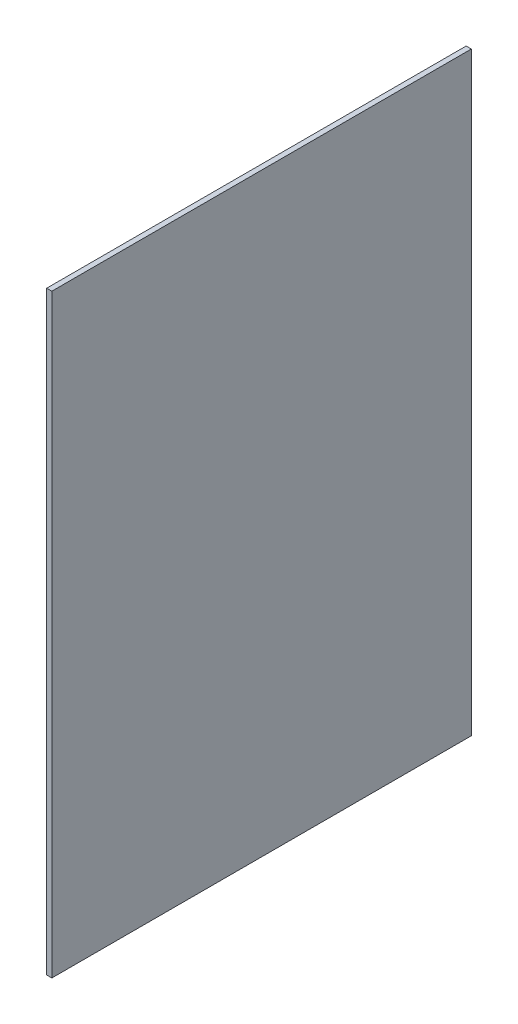
ISO-10303-21;
HEADER;
FILE_DESCRIPTION(('STEP AP214'),'2;1');
FILE_NAME('part.step','',(''),(''),'','','');
FILE_SCHEMA(('AUTOMOTIVE_DESIGN { 1 0 10303 214 1 1 1 1 }'));
ENDSEC;
DATA;
#1=APPLICATION_CONTEXT('core data for automotive mechanical design processes');
#2=APPLICATION_PROTOCOL_DEFINITION('international standard','automotive_design',2000,#1);
#3=PRODUCT_CONTEXT('',#1,'mechanical');
#4=PRODUCT('Part','Part','',(#3));
#5=PRODUCT_RELATED_PRODUCT_CATEGORY('part','',(#4));
#6=PRODUCT_DEFINITION_FORMATION('','',#4);
#7=PRODUCT_DEFINITION_CONTEXT('part definition',#1,'design');
#8=PRODUCT_DEFINITION('design','',#6,#7);
#9=PRODUCT_DEFINITION_SHAPE('','',#8);
#10=(LENGTH_UNIT() NAMED_UNIT(*) SI_UNIT(.MILLI.,.METRE.));
#11=(NAMED_UNIT(*) PLANE_ANGLE_UNIT() SI_UNIT($,.RADIAN.));
#12=(NAMED_UNIT(*) SI_UNIT($,.STERADIAN.) SOLID_ANGLE_UNIT());
#13=UNCERTAINTY_MEASURE_WITH_UNIT(LENGTH_MEASURE(1.E-05),#10,'distance_accuracy_value','');
#14=(GEOMETRIC_REPRESENTATION_CONTEXT(3) GLOBAL_UNCERTAINTY_ASSIGNED_CONTEXT((#13)) GLOBAL_UNIT_ASSIGNED_CONTEXT((#10,
#11,#12)) REPRESENTATION_CONTEXT('',''));
#15=CARTESIAN_POINT('',(0.,0.,0.));
#16=DIRECTION('',(0.,0.,1.));
#17=DIRECTION('',(1.,0.,0.));
#18=AXIS2_PLACEMENT_3D('',#15,#16,#17);
#19=CARTESIAN_POINT('',(281.,-45.,81.035636223129));
#20=DIRECTION('',(0.,0.,-1.));
#21=DIRECTION('',(-1.,0.,0.));
#22=AXIS2_PLACEMENT_3D('',#19,#20,#21);
#23=PLANE('',#22);
#24=DIRECTION('',(0.,-1.,0.));
#25=VECTOR('',#24,1.);
#26=CARTESIAN_POINT('',(280.,-45.,81.035636223129));
#27=LINE('',#26,#25);
#28=CARTESIAN_POINT('',(280.,69.8959813156576,81.035636223129));
#29=VERTEX_POINT('',#28);
#30=CARTESIAN_POINT('',(280.,-45.,81.035636223129));
#31=VERTEX_POINT('',#30);
#32=EDGE_CURVE('E101',#29,#31,#27,.T.);
#33=ORIENTED_EDGE('',*,*,#32,.T.);
#34=DIRECTION('',(-1.,0.,0.));
#35=VECTOR('',#34,1.);
#36=CARTESIAN_POINT('',(281.,-45.,81.035636223129));
#37=LINE('',#36,#35);
#38=CARTESIAN_POINT('',(281.,-45.,81.035636223129));
#39=VERTEX_POINT('',#38);
#40=EDGE_CURVE('E11',#39,#31,#37,.T.);
#41=ORIENTED_EDGE('',*,*,#40,.F.);
#42=DIRECTION('',(0.,-1.,0.));
#43=VECTOR('',#42,1.);
#44=CARTESIAN_POINT('',(281.,-45.,81.035636223129));
#45=LINE('',#44,#43);
#46=CARTESIAN_POINT('',(281.,69.8959813156576,81.035636223129));
#47=VERTEX_POINT('',#46);
#48=EDGE_CURVE('E89',#47,#39,#45,.T.);
#49=ORIENTED_EDGE('',*,*,#48,.F.);
#50=DIRECTION('',(-1.,0.,0.));
#51=VECTOR('',#50,1.);
#52=CARTESIAN_POINT('',(281.,69.8959813156576,81.035636223129));
#53=LINE('',#52,#51);
#54=EDGE_CURVE('E97',#47,#29,#53,.T.);
#55=ORIENTED_EDGE('',*,*,#54,.T.);
#56=EDGE_LOOP('',(#33,#41,#49,#55));
#57=FACE_BOUND('',#56,.T.);
#58=ADVANCED_FACE('F38',(#57),#23,.F.);
#59=CARTESIAN_POINT('',(281.,-45.,81.035636223129));
#60=DIRECTION('',(0.,1.,0.));
#61=DIRECTION('',(0.,0.,1.));
#62=AXIS2_PLACEMENT_3D('',#59,#60,#61);
#63=PLANE('',#62);
#64=DIRECTION('',(0.,0.,-1.));
#65=VECTOR('',#64,1.);
#66=CARTESIAN_POINT('',(280.,-45.,81.035636223129));
#67=LINE('',#66,#65);
#68=CARTESIAN_POINT('',(280.,-45.,0.));
#69=VERTEX_POINT('',#68);
#70=EDGE_CURVE('E93',#31,#69,#67,.T.);
#71=ORIENTED_EDGE('',*,*,#70,.T.);
#72=DIRECTION('',(-1.,0.,0.));
#73=VECTOR('',#72,1.);
#74=CARTESIAN_POINT('',(281.,-45.,0.));
#75=LINE('',#74,#73);
#76=CARTESIAN_POINT('',(281.,-45.,0.));
#77=VERTEX_POINT('',#76);
#78=EDGE_CURVE('E46',#77,#69,#75,.T.);
#79=ORIENTED_EDGE('',*,*,#78,.F.);
#80=DIRECTION('',(0.,0.,-1.));
#81=VECTOR('',#80,1.);
#82=CARTESIAN_POINT('',(281.,-45.,81.035636223129));
#83=LINE('',#82,#81);
#84=EDGE_CURVE('E84',#39,#77,#83,.T.);
#85=ORIENTED_EDGE('',*,*,#84,.F.);
#86=ORIENTED_EDGE('',*,*,#40,.T.);
#87=EDGE_LOOP('',(#71,#79,#85,#86));
#88=FACE_BOUND('',#87,.T.);
#89=ADVANCED_FACE('F92',(#88),#63,.F.);
#90=CARTESIAN_POINT('',(281.,-45.,0.));
#91=DIRECTION('',(0.,0.,1.));
#92=DIRECTION('',(1.,0.,0.));
#93=AXIS2_PLACEMENT_3D('',#90,#91,#92);
#94=PLANE('',#93);
#95=DIRECTION('',(0.,1.,0.));
#96=VECTOR('',#95,1.);
#97=CARTESIAN_POINT('',(280.,-45.,0.));
#98=LINE('',#97,#96);
#99=CARTESIAN_POINT('',(280.,69.8959813156576,0.));
#100=VERTEX_POINT('',#99);
#101=EDGE_CURVE('E71',#69,#100,#98,.T.);
#102=ORIENTED_EDGE('',*,*,#101,.T.);
#103=DIRECTION('',(-1.,0.,0.));
#104=VECTOR('',#103,1.);
#105=CARTESIAN_POINT('',(281.,69.8959813156576,0.));
#106=LINE('',#105,#104);
#107=CARTESIAN_POINT('',(281.,69.8959813156576,0.));
#108=VERTEX_POINT('',#107);
#109=EDGE_CURVE('E94',#108,#100,#106,.T.);
#110=ORIENTED_EDGE('',*,*,#109,.F.);
#111=DIRECTION('',(0.,1.,0.));
#112=VECTOR('',#111,1.);
#113=CARTESIAN_POINT('',(281.,-45.,0.));
#114=LINE('',#113,#112);
#115=EDGE_CURVE('E87',#77,#108,#114,.T.);
#116=ORIENTED_EDGE('',*,*,#115,.F.);
#117=ORIENTED_EDGE('',*,*,#78,.T.);
#118=EDGE_LOOP('',(#102,#110,#116,#117));
#119=FACE_BOUND('',#118,.T.);
#120=ADVANCED_FACE('F95',(#119),#94,.F.);
#121=CARTESIAN_POINT('',(281.,69.8959813156576,81.035636223129));
#122=DIRECTION('',(0.,-1.,0.));
#123=DIRECTION('',(0.,0.,-1.));
#124=AXIS2_PLACEMENT_3D('',#121,#122,#123);
#125=PLANE('',#124);
#126=DIRECTION('',(0.,0.,1.));
#127=VECTOR('',#126,1.);
#128=CARTESIAN_POINT('',(280.,69.8959813156576,81.035636223129));
#129=LINE('',#128,#127);
#130=EDGE_CURVE('E77',#100,#29,#129,.T.);
#131=ORIENTED_EDGE('',*,*,#130,.T.);
#132=ORIENTED_EDGE('',*,*,#54,.F.);
#133=DIRECTION('',(0.,0.,1.));
#134=VECTOR('',#133,1.);
#135=CARTESIAN_POINT('',(281.,69.8959813156576,81.035636223129));
#136=LINE('',#135,#134);
#137=EDGE_CURVE('E54',#108,#47,#136,.T.);
#138=ORIENTED_EDGE('',*,*,#137,.F.);
#139=ORIENTED_EDGE('',*,*,#109,.T.);
#140=EDGE_LOOP('',(#131,#132,#138,#139));
#141=FACE_BOUND('',#140,.T.);
#142=ADVANCED_FACE('F108',(#141),#125,.F.);
#143=CARTESIAN_POINT('',(281.,0.,0.));
#144=DIRECTION('',(-1.,0.,0.));
#145=DIRECTION('',(0.,0.,1.));
#146=AXIS2_PLACEMENT_3D('',#143,#144,#145);
#147=PLANE('',#146);
#148=ORIENTED_EDGE('',*,*,#48,.T.);
#149=ORIENTED_EDGE('',*,*,#84,.T.);
#150=ORIENTED_EDGE('',*,*,#115,.T.);
#151=ORIENTED_EDGE('',*,*,#137,.T.);
#152=EDGE_LOOP('',(#148,#149,#150,#151));
#153=FACE_BOUND('',#152,.T.);
#154=ADVANCED_FACE('F85',(#153),#147,.F.);
#155=CARTESIAN_POINT('',(280.,0.,0.));
#156=DIRECTION('',(-1.,0.,0.));
#157=DIRECTION('',(0.,0.,1.));
#158=AXIS2_PLACEMENT_3D('',#155,#156,#157);
#159=PLANE('',#158);
#160=ORIENTED_EDGE('',*,*,#32,.F.);
#161=ORIENTED_EDGE('',*,*,#130,.F.);
#162=ORIENTED_EDGE('',*,*,#101,.F.);
#163=ORIENTED_EDGE('',*,*,#70,.F.);
#164=EDGE_LOOP('',(#160,#161,#162,#163));
#165=FACE_BOUND('',#164,.T.);
#166=ADVANCED_FACE('F111',(#165),#159,.T.);
#167=CLOSED_SHELL('',(#58,#89,#120,#142,#154,#166));
#168=MANIFOLD_SOLID_BREP('B2',#167);
#169=ADVANCED_BREP_SHAPE_REPRESENTATION('',(#18,#168),#14);
#170=SHAPE_DEFINITION_REPRESENTATION(#9,#169);
ENDSEC;
END-ISO-10303-21;
